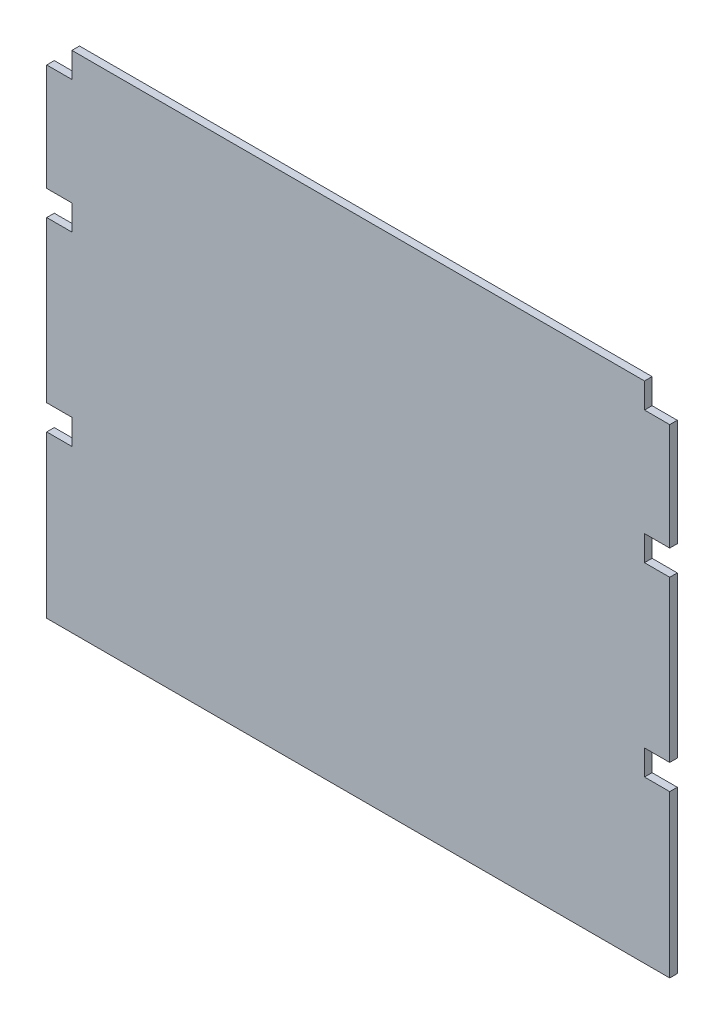
ISO-10303-21;
HEADER;
FILE_DESCRIPTION(('STEP AP214'),'2;1');
FILE_NAME('part.step','',(''),(''),'','','');
FILE_SCHEMA(('AUTOMOTIVE_DESIGN { 1 0 10303 214 1 1 1 1 }'));
ENDSEC;
DATA;
#1=APPLICATION_CONTEXT('core data for automotive mechanical design processes');
#2=APPLICATION_PROTOCOL_DEFINITION('international standard','automotive_design',2000,#1);
#3=PRODUCT_CONTEXT('',#1,'mechanical');
#4=PRODUCT('Part','Part','',(#3));
#5=PRODUCT_RELATED_PRODUCT_CATEGORY('part','',(#4));
#6=PRODUCT_DEFINITION_FORMATION('','',#4);
#7=PRODUCT_DEFINITION_CONTEXT('part definition',#1,'design');
#8=PRODUCT_DEFINITION('design','',#6,#7);
#9=PRODUCT_DEFINITION_SHAPE('','',#8);
#10=(LENGTH_UNIT() NAMED_UNIT(*) SI_UNIT(.MILLI.,.METRE.));
#11=(NAMED_UNIT(*) PLANE_ANGLE_UNIT() SI_UNIT($,.RADIAN.));
#12=(NAMED_UNIT(*) SI_UNIT($,.STERADIAN.) SOLID_ANGLE_UNIT());
#13=UNCERTAINTY_MEASURE_WITH_UNIT(LENGTH_MEASURE(1.E-05),#10,'distance_accuracy_value','');
#14=(GEOMETRIC_REPRESENTATION_CONTEXT(3) GLOBAL_UNCERTAINTY_ASSIGNED_CONTEXT((#13)) GLOBAL_UNIT_ASSIGNED_CONTEXT((#10,
#11,#12)) REPRESENTATION_CONTEXT('',''));
#15=CARTESIAN_POINT('',(0.,0.,0.));
#16=DIRECTION('',(0.,0.,1.));
#17=DIRECTION('',(1.,0.,0.));
#18=AXIS2_PLACEMENT_3D('',#15,#16,#17);
#19=CARTESIAN_POINT('',(0.,0.,3.));
#20=DIRECTION('',(1.,0.,0.));
#21=DIRECTION('',(0.,0.,-1.));
#22=AXIS2_PLACEMENT_3D('',#19,#20,#21);
#23=PLANE('',#22);
#24=DIRECTION('',(0.,-1.,0.));
#25=VECTOR('',#24,1.);
#26=CARTESIAN_POINT('',(0.,0.,0.));
#27=LINE('',#26,#25);
#28=CARTESIAN_POINT('',(0.,137.6,0.));
#29=VERTEX_POINT('',#28);
#30=CARTESIAN_POINT('',(0.,74.,0.));
#31=VERTEX_POINT('',#30);
#32=EDGE_CURVE('E257',#29,#31,#27,.T.);
#33=ORIENTED_EDGE('',*,*,#32,.T.);
#34=DIRECTION('',(0.,0.,1.));
#35=VECTOR('',#34,1.);
#36=CARTESIAN_POINT('',(0.,74.,0.));
#37=LINE('',#36,#35);
#38=CARTESIAN_POINT('',(0.,74.,3.));
#39=VERTEX_POINT('',#38);
#40=EDGE_CURVE('E295',#31,#39,#37,.T.);
#41=ORIENTED_EDGE('',*,*,#40,.T.);
#42=DIRECTION('',(0.,-1.,0.));
#43=VECTOR('',#42,1.);
#44=CARTESIAN_POINT('',(0.,0.,3.));
#45=LINE('',#44,#43);
#46=CARTESIAN_POINT('',(0.,137.6,3.));
#47=VERTEX_POINT('',#46);
#48=EDGE_CURVE('E238',#47,#39,#45,.T.);
#49=ORIENTED_EDGE('',*,*,#48,.F.);
#50=DIRECTION('',(0.,0.,1.));
#51=VECTOR('',#50,1.);
#52=CARTESIAN_POINT('',(0.,137.6,0.));
#53=LINE('',#52,#51);
#54=EDGE_CURVE('E309',#29,#47,#53,.T.);
#55=ORIENTED_EDGE('',*,*,#54,.F.);
#56=EDGE_LOOP('',(#33,#41,#49,#55));
#57=FACE_BOUND('',#56,.T.);
#58=ADVANCED_FACE('F33',(#57),#23,.F.);
#59=CARTESIAN_POINT('',(0.,190.,0.));
#60=VERTEX_POINT('',#59);
#61=CARTESIAN_POINT('',(0.,147.6,0.));
#62=VERTEX_POINT('',#61);
#63=EDGE_CURVE('E223',#60,#62,#27,.T.);
#64=ORIENTED_EDGE('',*,*,#63,.T.);
#65=DIRECTION('',(0.,0.,1.));
#66=VECTOR('',#65,1.);
#67=CARTESIAN_POINT('',(0.,147.6,0.));
#68=LINE('',#67,#66);
#69=CARTESIAN_POINT('',(0.,147.6,3.));
#70=VERTEX_POINT('',#69);
#71=EDGE_CURVE('E274',#62,#70,#68,.T.);
#72=ORIENTED_EDGE('',*,*,#71,.T.);
#73=CARTESIAN_POINT('',(0.,190.,3.));
#74=VERTEX_POINT('',#73);
#75=EDGE_CURVE('E240',#74,#70,#45,.T.);
#76=ORIENTED_EDGE('',*,*,#75,.F.);
#77=DIRECTION('',(0.,0.,1.));
#78=VECTOR('',#77,1.);
#79=CARTESIAN_POINT('',(0.,190.,0.));
#80=LINE('',#79,#78);
#81=EDGE_CURVE('E276',#60,#74,#80,.T.);
#82=ORIENTED_EDGE('',*,*,#81,.F.);
#83=EDGE_LOOP('',(#64,#72,#76,#82));
#84=FACE_BOUND('',#83,.T.);
#85=ADVANCED_FACE('F272',(#84),#23,.F.);
#86=CARTESIAN_POINT('',(247.,0.,3.));
#87=DIRECTION('',(-1.,0.,0.));
#88=DIRECTION('',(0.,0.,1.));
#89=AXIS2_PLACEMENT_3D('',#86,#87,#88);
#90=PLANE('',#89);
#91=DIRECTION('',(0.,1.,0.));
#92=VECTOR('',#91,1.);
#93=CARTESIAN_POINT('',(247.,0.,0.));
#94=LINE('',#93,#92);
#95=CARTESIAN_POINT('',(247.,74.,0.));
#96=VERTEX_POINT('',#95);
#97=CARTESIAN_POINT('',(247.,137.6,0.));
#98=VERTEX_POINT('',#97);
#99=EDGE_CURVE('E218',#96,#98,#94,.T.);
#100=ORIENTED_EDGE('',*,*,#99,.T.);
#101=DIRECTION('',(0.,0.,1.));
#102=VECTOR('',#101,1.);
#103=CARTESIAN_POINT('',(247.,137.6,0.));
#104=LINE('',#103,#102);
#105=CARTESIAN_POINT('',(247.,137.6,3.));
#106=VERTEX_POINT('',#105);
#107=EDGE_CURVE('E332',#98,#106,#104,.T.);
#108=ORIENTED_EDGE('',*,*,#107,.T.);
#109=DIRECTION('',(0.,1.,0.));
#110=VECTOR('',#109,1.);
#111=CARTESIAN_POINT('',(247.,0.,3.));
#112=LINE('',#111,#110);
#113=CARTESIAN_POINT('',(247.,74.,3.));
#114=VERTEX_POINT('',#113);
#115=EDGE_CURVE('E252',#114,#106,#112,.T.);
#116=ORIENTED_EDGE('',*,*,#115,.F.);
#117=DIRECTION('',(0.,0.,1.));
#118=VECTOR('',#117,1.);
#119=CARTESIAN_POINT('',(247.,74.,0.));
#120=LINE('',#119,#118);
#121=EDGE_CURVE('E407',#96,#114,#120,.T.);
#122=ORIENTED_EDGE('',*,*,#121,.F.);
#123=EDGE_LOOP('',(#100,#108,#116,#122));
#124=FACE_BOUND('',#123,.T.);
#125=ADVANCED_FACE('F428',(#124),#90,.F.);
#126=CARTESIAN_POINT('',(247.,0.,0.));
#127=VERTEX_POINT('',#126);
#128=CARTESIAN_POINT('',(247.,64.,0.));
#129=VERTEX_POINT('',#128);
#130=EDGE_CURVE('E221',#127,#129,#94,.T.);
#131=ORIENTED_EDGE('',*,*,#130,.T.);
#132=DIRECTION('',(0.,0.,1.));
#133=VECTOR('',#132,1.);
#134=CARTESIAN_POINT('',(247.,64.,0.));
#135=LINE('',#134,#133);
#136=CARTESIAN_POINT('',(247.,64.,3.));
#137=VERTEX_POINT('',#136);
#138=EDGE_CURVE('E386',#129,#137,#135,.T.);
#139=ORIENTED_EDGE('',*,*,#138,.T.);
#140=CARTESIAN_POINT('',(247.,0.,3.));
#141=VERTEX_POINT('',#140);
#142=EDGE_CURVE('E245',#141,#137,#112,.T.);
#143=ORIENTED_EDGE('',*,*,#142,.F.);
#144=DIRECTION('',(0.,0.,-1.));
#145=VECTOR('',#144,1.);
#146=CARTESIAN_POINT('',(247.,0.,3.));
#147=LINE('',#146,#145);
#148=EDGE_CURVE('E41',#141,#127,#147,.T.);
#149=ORIENTED_EDGE('',*,*,#148,.T.);
#150=EDGE_LOOP('',(#131,#139,#143,#149));
#151=FACE_BOUND('',#150,.T.);
#152=ADVANCED_FACE('F385',(#151),#90,.F.);
#153=CARTESIAN_POINT('',(0.,64.,3.));
#154=VERTEX_POINT('',#153);
#155=CARTESIAN_POINT('',(0.,0.,3.));
#156=VERTEX_POINT('',#155);
#157=EDGE_CURVE('E233',#154,#156,#45,.T.);
#158=ORIENTED_EDGE('',*,*,#157,.F.);
#159=DIRECTION('',(0.,0.,1.));
#160=VECTOR('',#159,1.);
#161=CARTESIAN_POINT('',(0.,64.,0.));
#162=LINE('',#161,#160);
#163=CARTESIAN_POINT('',(0.,64.,0.));
#164=VERTEX_POINT('',#163);
#165=EDGE_CURVE('E355',#164,#154,#162,.T.);
#166=ORIENTED_EDGE('',*,*,#165,.F.);
#167=CARTESIAN_POINT('',(0.,0.,0.));
#168=VERTEX_POINT('',#167);
#169=EDGE_CURVE('E256',#164,#168,#27,.T.);
#170=ORIENTED_EDGE('',*,*,#169,.T.);
#171=DIRECTION('',(0.,0.,-1.));
#172=VECTOR('',#171,1.);
#173=CARTESIAN_POINT('',(0.,0.,3.));
#174=LINE('',#173,#172);
#175=EDGE_CURVE('E11',#156,#168,#174,.T.);
#176=ORIENTED_EDGE('',*,*,#175,.F.);
#177=EDGE_LOOP('',(#158,#166,#170,#176));
#178=FACE_BOUND('',#177,.T.);
#179=ADVANCED_FACE('F35',(#178),#23,.F.);
#180=CARTESIAN_POINT('',(0.,0.,3.));
#181=DIRECTION('',(0.,1.,0.));
#182=DIRECTION('',(0.,0.,1.));
#183=AXIS2_PLACEMENT_3D('',#180,#181,#182);
#184=PLANE('',#183);
#185=DIRECTION('',(1.,0.,0.));
#186=VECTOR('',#185,1.);
#187=CARTESIAN_POINT('',(0.,0.,0.));
#188=LINE('',#187,#186);
#189=EDGE_CURVE('E219',#168,#127,#188,.T.);
#190=ORIENTED_EDGE('',*,*,#189,.T.);
#191=ORIENTED_EDGE('',*,*,#148,.F.);
#192=DIRECTION('',(1.,0.,0.));
#193=VECTOR('',#192,1.);
#194=CARTESIAN_POINT('',(0.,0.,3.));
#195=LINE('',#194,#193);
#196=EDGE_CURVE('E336',#156,#141,#195,.T.);
#197=ORIENTED_EDGE('',*,*,#196,.F.);
#198=ORIENTED_EDGE('',*,*,#175,.T.);
#199=EDGE_LOOP('',(#190,#191,#197,#198));
#200=FACE_BOUND('',#199,.T.);
#201=ADVANCED_FACE('F384',(#200),#184,.F.);
#202=CARTESIAN_POINT('',(247.,147.6,3.));
#203=VERTEX_POINT('',#202);
#204=CARTESIAN_POINT('',(247.,190.,3.));
#205=VERTEX_POINT('',#204);
#206=EDGE_CURVE('E210',#203,#205,#112,.T.);
#207=ORIENTED_EDGE('',*,*,#206,.F.);
#208=DIRECTION('',(0.,0.,1.));
#209=VECTOR('',#208,1.);
#210=CARTESIAN_POINT('',(247.,147.6,0.));
#211=LINE('',#210,#209);
#212=CARTESIAN_POINT('',(247.,147.6,0.));
#213=VERTEX_POINT('',#212);
#214=EDGE_CURVE('E197',#213,#203,#211,.T.);
#215=ORIENTED_EDGE('',*,*,#214,.F.);
#216=CARTESIAN_POINT('',(247.,190.,0.));
#217=VERTEX_POINT('',#216);
#218=EDGE_CURVE('E208',#213,#217,#94,.T.);
#219=ORIENTED_EDGE('',*,*,#218,.T.);
#220=DIRECTION('',(0.,0.,1.));
#221=VECTOR('',#220,1.);
#222=CARTESIAN_POINT('',(247.,190.,0.));
#223=LINE('',#222,#221);
#224=EDGE_CURVE('E258',#217,#205,#223,.T.);
#225=ORIENTED_EDGE('',*,*,#224,.T.);
#226=EDGE_LOOP('',(#207,#215,#219,#225));
#227=FACE_BOUND('',#226,.T.);
#228=ADVANCED_FACE('F206',(#227),#90,.F.);
#229=CARTESIAN_POINT('',(0.,200.,3.));
#230=DIRECTION('',(0.,-1.,0.));
#231=DIRECTION('',(0.,0.,-1.));
#232=AXIS2_PLACEMENT_3D('',#229,#230,#231);
#233=PLANE('',#232);
#234=DIRECTION('',(-1.,0.,0.));
#235=VECTOR('',#234,1.);
#236=CARTESIAN_POINT('',(0.,200.,0.));
#237=LINE('',#236,#235);
#238=CARTESIAN_POINT('',(237.,200.,0.));
#239=VERTEX_POINT('',#238);
#240=CARTESIAN_POINT('',(10.,200.,0.));
#241=VERTEX_POINT('',#240);
#242=EDGE_CURVE('E227',#239,#241,#237,.T.);
#243=ORIENTED_EDGE('',*,*,#242,.T.);
#244=DIRECTION('',(0.,0.,1.));
#245=VECTOR('',#244,1.);
#246=CARTESIAN_POINT('',(10.,200.,0.));
#247=LINE('',#246,#245);
#248=CARTESIAN_POINT('',(10.,200.,3.));
#249=VERTEX_POINT('',#248);
#250=EDGE_CURVE('E301',#241,#249,#247,.T.);
#251=ORIENTED_EDGE('',*,*,#250,.T.);
#252=DIRECTION('',(-1.,0.,0.));
#253=VECTOR('',#252,1.);
#254=CARTESIAN_POINT('',(0.,200.,3.));
#255=LINE('',#254,#253);
#256=CARTESIAN_POINT('',(237.,200.,3.));
#257=VERTEX_POINT('',#256);
#258=EDGE_CURVE('E241',#257,#249,#255,.T.);
#259=ORIENTED_EDGE('',*,*,#258,.F.);
#260=DIRECTION('',(0.,0.,1.));
#261=VECTOR('',#260,1.);
#262=CARTESIAN_POINT('',(237.,200.,0.));
#263=LINE('',#262,#261);
#264=EDGE_CURVE('E328',#239,#257,#263,.T.);
#265=ORIENTED_EDGE('',*,*,#264,.F.);
#266=EDGE_LOOP('',(#243,#251,#259,#265));
#267=FACE_BOUND('',#266,.T.);
#268=ADVANCED_FACE('F441',(#267),#233,.F.);
#269=CARTESIAN_POINT('',(0.,0.,3.));
#270=DIRECTION('',(0.,0.,-1.));
#271=DIRECTION('',(-1.,0.,0.));
#272=AXIS2_PLACEMENT_3D('',#269,#270,#271);
#273=PLANE('',#272);
#274=ORIENTED_EDGE('',*,*,#115,.T.);
#275=DIRECTION('',(1.,0.,0.));
#276=VECTOR('',#275,1.);
#277=CARTESIAN_POINT('',(247.,137.6,3.));
#278=LINE('',#277,#276);
#279=CARTESIAN_POINT('',(237.,137.6,3.));
#280=VERTEX_POINT('',#279);
#281=EDGE_CURVE('E202',#280,#106,#278,.T.);
#282=ORIENTED_EDGE('',*,*,#281,.F.);
#283=DIRECTION('',(0.,-1.,0.));
#284=VECTOR('',#283,1.);
#285=CARTESIAN_POINT('',(237.,147.6,3.));
#286=LINE('',#285,#284);
#287=CARTESIAN_POINT('',(237.,147.6,3.));
#288=VERTEX_POINT('',#287);
#289=EDGE_CURVE('E559',#288,#280,#286,.T.);
#290=ORIENTED_EDGE('',*,*,#289,.F.);
#291=DIRECTION('',(-1.,0.,0.));
#292=VECTOR('',#291,1.);
#293=CARTESIAN_POINT('',(247.,147.6,3.));
#294=LINE('',#293,#292);
#295=EDGE_CURVE('E402',#203,#288,#294,.T.);
#296=ORIENTED_EDGE('',*,*,#295,.F.);
#297=ORIENTED_EDGE('',*,*,#206,.T.);
#298=DIRECTION('',(1.,0.,0.));
#299=VECTOR('',#298,1.);
#300=CARTESIAN_POINT('',(247.,190.,3.));
#301=LINE('',#300,#299);
#302=CARTESIAN_POINT('',(237.,190.,3.));
#303=VERTEX_POINT('',#302);
#304=EDGE_CURVE('E326',#303,#205,#301,.T.);
#305=ORIENTED_EDGE('',*,*,#304,.F.);
#306=DIRECTION('',(0.,-1.,0.));
#307=VECTOR('',#306,1.);
#308=CARTESIAN_POINT('',(237.,200.,3.));
#309=LINE('',#308,#307);
#310=EDGE_CURVE('E329',#257,#303,#309,.T.);
#311=ORIENTED_EDGE('',*,*,#310,.F.);
#312=ORIENTED_EDGE('',*,*,#258,.T.);
#313=DIRECTION('',(0.,1.,0.));
#314=VECTOR('',#313,1.);
#315=CARTESIAN_POINT('',(10.,200.,3.));
#316=LINE('',#315,#314);
#317=CARTESIAN_POINT('',(10.,190.,3.));
#318=VERTEX_POINT('',#317);
#319=EDGE_CURVE('E314',#318,#249,#316,.T.);
#320=ORIENTED_EDGE('',*,*,#319,.F.);
#321=DIRECTION('',(1.,0.,0.));
#322=VECTOR('',#321,1.);
#323=CARTESIAN_POINT('',(0.,190.,3.));
#324=LINE('',#323,#322);
#325=EDGE_CURVE('E316',#74,#318,#324,.T.);
#326=ORIENTED_EDGE('',*,*,#325,.F.);
#327=ORIENTED_EDGE('',*,*,#75,.T.);
#328=DIRECTION('',(-1.,0.,0.));
#329=VECTOR('',#328,1.);
#330=CARTESIAN_POINT('',(0.,147.6,3.));
#331=LINE('',#330,#329);
#332=CARTESIAN_POINT('',(10.,147.6,3.));
#333=VERTEX_POINT('',#332);
#334=EDGE_CURVE('E299',#333,#70,#331,.T.);
#335=ORIENTED_EDGE('',*,*,#334,.F.);
#336=DIRECTION('',(0.,1.,0.));
#337=VECTOR('',#336,1.);
#338=CARTESIAN_POINT('',(10.,147.6,3.));
#339=LINE('',#338,#337);
#340=CARTESIAN_POINT('',(10.,137.6,3.));
#341=VERTEX_POINT('',#340);
#342=EDGE_CURVE('E288',#341,#333,#339,.T.);
#343=ORIENTED_EDGE('',*,*,#342,.F.);
#344=DIRECTION('',(1.,0.,0.));
#345=VECTOR('',#344,1.);
#346=CARTESIAN_POINT('',(0.,137.6,3.));
#347=LINE('',#346,#345);
#348=EDGE_CURVE('E292',#47,#341,#347,.T.);
#349=ORIENTED_EDGE('',*,*,#348,.F.);
#350=ORIENTED_EDGE('',*,*,#48,.T.);
#351=DIRECTION('',(-1.,0.,0.));
#352=VECTOR('',#351,1.);
#353=CARTESIAN_POINT('',(0.,74.,3.));
#354=LINE('',#353,#352);
#355=CARTESIAN_POINT('',(10.,74.,3.));
#356=VERTEX_POINT('',#355);
#357=EDGE_CURVE('E306',#356,#39,#354,.T.);
#358=ORIENTED_EDGE('',*,*,#357,.F.);
#359=DIRECTION('',(0.,1.,0.));
#360=VECTOR('',#359,1.);
#361=CARTESIAN_POINT('',(10.,74.,3.));
#362=LINE('',#361,#360);
#363=CARTESIAN_POINT('',(10.,64.,3.));
#364=VERTEX_POINT('',#363);
#365=EDGE_CURVE('E370',#364,#356,#362,.T.);
#366=ORIENTED_EDGE('',*,*,#365,.F.);
#367=DIRECTION('',(1.,0.,0.));
#368=VECTOR('',#367,1.);
#369=CARTESIAN_POINT('',(0.,64.,3.));
#370=LINE('',#369,#368);
#371=EDGE_CURVE('E367',#154,#364,#370,.T.);
#372=ORIENTED_EDGE('',*,*,#371,.F.);
#373=ORIENTED_EDGE('',*,*,#157,.T.);
#374=ORIENTED_EDGE('',*,*,#196,.T.);
#375=ORIENTED_EDGE('',*,*,#142,.T.);
#376=DIRECTION('',(1.,0.,0.));
#377=VECTOR('',#376,1.);
#378=CARTESIAN_POINT('',(247.,64.,3.));
#379=LINE('',#378,#377);
#380=CARTESIAN_POINT('',(237.,64.,3.));
#381=VERTEX_POINT('',#380);
#382=EDGE_CURVE('E389',#381,#137,#379,.T.);
#383=ORIENTED_EDGE('',*,*,#382,.F.);
#384=DIRECTION('',(0.,-1.,0.));
#385=VECTOR('',#384,1.);
#386=CARTESIAN_POINT('',(237.,74.,3.));
#387=LINE('',#386,#385);
#388=CARTESIAN_POINT('',(237.,74.,3.));
#389=VERTEX_POINT('',#388);
#390=EDGE_CURVE('E392',#389,#381,#387,.T.);
#391=ORIENTED_EDGE('',*,*,#390,.F.);
#392=DIRECTION('',(-1.,0.,0.));
#393=VECTOR('',#392,1.);
#394=CARTESIAN_POINT('',(247.,74.,3.));
#395=LINE('',#394,#393);
#396=EDGE_CURVE('E375',#114,#389,#395,.T.);
#397=ORIENTED_EDGE('',*,*,#396,.F.);
#398=EDGE_LOOP('',(#274,#282,#290,#296,#297,#305,#311,#312,#320,#326,#327,#335,#343,#349,#350,
#358,#366,#372,#373,#374,#375,#383,#391,#397));
#399=FACE_BOUND('',#398,.T.);
#400=ADVANCED_FACE('F345',(#399),#273,.F.);
#401=CARTESIAN_POINT('',(0.,0.,0.));
#402=DIRECTION('',(0.,0.,-1.));
#403=DIRECTION('',(-1.,0.,0.));
#404=AXIS2_PLACEMENT_3D('',#401,#402,#403);
#405=PLANE('',#404);
#406=DIRECTION('',(1.,0.,0.));
#407=VECTOR('',#406,1.);
#408=CARTESIAN_POINT('',(247.,137.6,0.));
#409=LINE('',#408,#407);
#410=CARTESIAN_POINT('',(237.,137.6,0.));
#411=VERTEX_POINT('',#410);
#412=EDGE_CURVE('E211',#411,#98,#409,.T.);
#413=ORIENTED_EDGE('',*,*,#412,.T.);
#414=ORIENTED_EDGE('',*,*,#99,.F.);
#415=DIRECTION('',(-1.,0.,0.));
#416=VECTOR('',#415,1.);
#417=CARTESIAN_POINT('',(247.,74.,0.));
#418=LINE('',#417,#416);
#419=CARTESIAN_POINT('',(237.,74.,0.));
#420=VERTEX_POINT('',#419);
#421=EDGE_CURVE('E394',#96,#420,#418,.T.);
#422=ORIENTED_EDGE('',*,*,#421,.T.);
#423=DIRECTION('',(0.,-1.,0.));
#424=VECTOR('',#423,1.);
#425=CARTESIAN_POINT('',(237.,74.,0.));
#426=LINE('',#425,#424);
#427=CARTESIAN_POINT('',(237.,64.,0.));
#428=VERTEX_POINT('',#427);
#429=EDGE_CURVE('E56',#420,#428,#426,.T.);
#430=ORIENTED_EDGE('',*,*,#429,.T.);
#431=DIRECTION('',(1.,0.,0.));
#432=VECTOR('',#431,1.);
#433=CARTESIAN_POINT('',(247.,64.,0.));
#434=LINE('',#433,#432);
#435=EDGE_CURVE('E408',#428,#129,#434,.T.);
#436=ORIENTED_EDGE('',*,*,#435,.T.);
#437=ORIENTED_EDGE('',*,*,#130,.F.);
#438=ORIENTED_EDGE('',*,*,#189,.F.);
#439=ORIENTED_EDGE('',*,*,#169,.F.);
#440=DIRECTION('',(1.,0.,0.));
#441=VECTOR('',#440,1.);
#442=CARTESIAN_POINT('',(0.,64.,0.));
#443=LINE('',#442,#441);
#444=CARTESIAN_POINT('',(10.,64.,0.));
#445=VERTEX_POINT('',#444);
#446=EDGE_CURVE('E359',#164,#445,#443,.T.);
#447=ORIENTED_EDGE('',*,*,#446,.T.);
#448=DIRECTION('',(0.,1.,0.));
#449=VECTOR('',#448,1.);
#450=CARTESIAN_POINT('',(10.,74.,0.));
#451=LINE('',#450,#449);
#452=CARTESIAN_POINT('',(10.,74.,0.));
#453=VERTEX_POINT('',#452);
#454=EDGE_CURVE('E356',#445,#453,#451,.T.);
#455=ORIENTED_EDGE('',*,*,#454,.T.);
#456=DIRECTION('',(-1.,0.,0.));
#457=VECTOR('',#456,1.);
#458=CARTESIAN_POINT('',(0.,74.,0.));
#459=LINE('',#458,#457);
#460=EDGE_CURVE('E362',#453,#31,#459,.T.);
#461=ORIENTED_EDGE('',*,*,#460,.T.);
#462=ORIENTED_EDGE('',*,*,#32,.F.);
#463=DIRECTION('',(1.,0.,0.));
#464=VECTOR('',#463,1.);
#465=CARTESIAN_POINT('',(0.,137.6,0.));
#466=LINE('',#465,#464);
#467=CARTESIAN_POINT('',(10.,137.6,0.));
#468=VERTEX_POINT('',#467);
#469=EDGE_CURVE('E287',#29,#468,#466,.T.);
#470=ORIENTED_EDGE('',*,*,#469,.T.);
#471=DIRECTION('',(0.,1.,0.));
#472=VECTOR('',#471,1.);
#473=CARTESIAN_POINT('',(10.,147.6,0.));
#474=LINE('',#473,#472);
#475=CARTESIAN_POINT('',(10.,147.6,0.));
#476=VERTEX_POINT('',#475);
#477=EDGE_CURVE('E285',#468,#476,#474,.T.);
#478=ORIENTED_EDGE('',*,*,#477,.T.);
#479=DIRECTION('',(-1.,0.,0.));
#480=VECTOR('',#479,1.);
#481=CARTESIAN_POINT('',(0.,147.6,0.));
#482=LINE('',#481,#480);
#483=EDGE_CURVE('E283',#476,#62,#482,.T.);
#484=ORIENTED_EDGE('',*,*,#483,.T.);
#485=ORIENTED_EDGE('',*,*,#63,.F.);
#486=DIRECTION('',(1.,0.,0.));
#487=VECTOR('',#486,1.);
#488=CARTESIAN_POINT('',(0.,190.,0.));
#489=LINE('',#488,#487);
#490=CARTESIAN_POINT('',(10.,190.,0.));
#491=VERTEX_POINT('',#490);
#492=EDGE_CURVE('E280',#60,#491,#489,.T.);
#493=ORIENTED_EDGE('',*,*,#492,.T.);
#494=DIRECTION('',(0.,1.,0.));
#495=VECTOR('',#494,1.);
#496=CARTESIAN_POINT('',(10.,200.,0.));
#497=LINE('',#496,#495);
#498=EDGE_CURVE('E313',#491,#241,#497,.T.);
#499=ORIENTED_EDGE('',*,*,#498,.T.);
#500=ORIENTED_EDGE('',*,*,#242,.F.);
#501=DIRECTION('',(0.,-1.,0.));
#502=VECTOR('',#501,1.);
#503=CARTESIAN_POINT('',(237.,200.,0.));
#504=LINE('',#503,#502);
#505=CARTESIAN_POINT('',(237.,190.,0.));
#506=VERTEX_POINT('',#505);
#507=EDGE_CURVE('E324',#239,#506,#504,.T.);
#508=ORIENTED_EDGE('',*,*,#507,.T.);
#509=DIRECTION('',(1.,0.,0.));
#510=VECTOR('',#509,1.);
#511=CARTESIAN_POINT('',(247.,190.,0.));
#512=LINE('',#511,#510);
#513=EDGE_CURVE('E217',#506,#217,#512,.T.);
#514=ORIENTED_EDGE('',*,*,#513,.T.);
#515=ORIENTED_EDGE('',*,*,#218,.F.);
#516=DIRECTION('',(-1.,0.,0.));
#517=VECTOR('',#516,1.);
#518=CARTESIAN_POINT('',(247.,147.6,0.));
#519=LINE('',#518,#517);
#520=CARTESIAN_POINT('',(237.,147.6,0.));
#521=VERTEX_POINT('',#520);
#522=EDGE_CURVE('E193',#213,#521,#519,.T.);
#523=ORIENTED_EDGE('',*,*,#522,.T.);
#524=DIRECTION('',(0.,-1.,0.));
#525=VECTOR('',#524,1.);
#526=CARTESIAN_POINT('',(237.,147.6,0.));
#527=LINE('',#526,#525);
#528=EDGE_CURVE('E48',#521,#411,#527,.T.);
#529=ORIENTED_EDGE('',*,*,#528,.T.);
#530=EDGE_LOOP('',(#413,#414,#422,#430,#436,#437,#438,#439,#447,#455,#461,#462,#470,#478,#484,
#485,#493,#499,#500,#508,#514,#515,#523,#529));
#531=FACE_BOUND('',#530,.T.);
#532=ADVANCED_FACE('F215',(#531),#405,.T.);
#533=CARTESIAN_POINT('',(247.,190.,0.));
#534=DIRECTION('',(0.,-1.,0.));
#535=DIRECTION('',(0.,0.,-1.));
#536=AXIS2_PLACEMENT_3D('',#533,#534,#535);
#537=PLANE('',#536);
#538=ORIENTED_EDGE('',*,*,#304,.T.);
#539=ORIENTED_EDGE('',*,*,#224,.F.);
#540=ORIENTED_EDGE('',*,*,#513,.F.);
#541=DIRECTION('',(0.,0.,1.));
#542=VECTOR('',#541,1.);
#543=CARTESIAN_POINT('',(237.,190.,0.));
#544=LINE('',#543,#542);
#545=EDGE_CURVE('E265',#506,#303,#544,.T.);
#546=ORIENTED_EDGE('',*,*,#545,.T.);
#547=EDGE_LOOP('',(#538,#539,#540,#546));
#548=FACE_BOUND('',#547,.T.);
#549=ADVANCED_FACE('F451',(#548),#537,.F.);
#550=CARTESIAN_POINT('',(237.,200.,0.));
#551=DIRECTION('',(-1.,0.,0.));
#552=DIRECTION('',(0.,0.,1.));
#553=AXIS2_PLACEMENT_3D('',#550,#551,#552);
#554=PLANE('',#553);
#555=ORIENTED_EDGE('',*,*,#310,.T.);
#556=ORIENTED_EDGE('',*,*,#545,.F.);
#557=ORIENTED_EDGE('',*,*,#507,.F.);
#558=ORIENTED_EDGE('',*,*,#264,.T.);
#559=EDGE_LOOP('',(#555,#556,#557,#558));
#560=FACE_BOUND('',#559,.T.);
#561=ADVANCED_FACE('F453',(#560),#554,.F.);
#562=CARTESIAN_POINT('',(10.,200.,0.));
#563=DIRECTION('',(1.,0.,0.));
#564=DIRECTION('',(0.,0.,-1.));
#565=AXIS2_PLACEMENT_3D('',#562,#563,#564);
#566=PLANE('',#565);
#567=ORIENTED_EDGE('',*,*,#319,.T.);
#568=ORIENTED_EDGE('',*,*,#250,.F.);
#569=ORIENTED_EDGE('',*,*,#498,.F.);
#570=DIRECTION('',(0.,0.,1.));
#571=VECTOR('',#570,1.);
#572=CARTESIAN_POINT('',(10.,190.,0.));
#573=LINE('',#572,#571);
#574=EDGE_CURVE('E321',#491,#318,#573,.T.);
#575=ORIENTED_EDGE('',*,*,#574,.T.);
#576=EDGE_LOOP('',(#567,#568,#569,#575));
#577=FACE_BOUND('',#576,.T.);
#578=ADVANCED_FACE('F456',(#577),#566,.F.);
#579=CARTESIAN_POINT('',(0.,190.,0.));
#580=DIRECTION('',(0.,-1.,0.));
#581=DIRECTION('',(0.,0.,-1.));
#582=AXIS2_PLACEMENT_3D('',#579,#580,#581);
#583=PLANE('',#582);
#584=ORIENTED_EDGE('',*,*,#325,.T.);
#585=ORIENTED_EDGE('',*,*,#574,.F.);
#586=ORIENTED_EDGE('',*,*,#492,.F.);
#587=ORIENTED_EDGE('',*,*,#81,.T.);
#588=EDGE_LOOP('',(#584,#585,#586,#587));
#589=FACE_BOUND('',#588,.T.);
#590=ADVANCED_FACE('F461',(#589),#583,.F.);
#591=CARTESIAN_POINT('',(0.,147.6,0.));
#592=DIRECTION('',(0.,1.,0.));
#593=DIRECTION('',(0.,0.,1.));
#594=AXIS2_PLACEMENT_3D('',#591,#592,#593);
#595=PLANE('',#594);
#596=ORIENTED_EDGE('',*,*,#334,.T.);
#597=ORIENTED_EDGE('',*,*,#71,.F.);
#598=ORIENTED_EDGE('',*,*,#483,.F.);
#599=DIRECTION('',(0.,0.,1.));
#600=VECTOR('',#599,1.);
#601=CARTESIAN_POINT('',(10.,147.6,0.));
#602=LINE('',#601,#600);
#603=EDGE_CURVE('E304',#476,#333,#602,.T.);
#604=ORIENTED_EDGE('',*,*,#603,.T.);
#605=EDGE_LOOP('',(#596,#597,#598,#604));
#606=FACE_BOUND('',#605,.T.);
#607=ADVANCED_FACE('F464',(#606),#595,.F.);
#608=CARTESIAN_POINT('',(10.,147.6,0.));
#609=DIRECTION('',(1.,0.,0.));
#610=DIRECTION('',(0.,0.,-1.));
#611=AXIS2_PLACEMENT_3D('',#608,#609,#610);
#612=PLANE('',#611);
#613=ORIENTED_EDGE('',*,*,#342,.T.);
#614=ORIENTED_EDGE('',*,*,#603,.F.);
#615=ORIENTED_EDGE('',*,*,#477,.F.);
#616=DIRECTION('',(0.,0.,1.));
#617=VECTOR('',#616,1.);
#618=CARTESIAN_POINT('',(10.,137.6,0.));
#619=LINE('',#618,#617);
#620=EDGE_CURVE('E307',#468,#341,#619,.T.);
#621=ORIENTED_EDGE('',*,*,#620,.T.);
#622=EDGE_LOOP('',(#613,#614,#615,#621));
#623=FACE_BOUND('',#622,.T.);
#624=ADVANCED_FACE('F418',(#623),#612,.F.);
#625=CARTESIAN_POINT('',(0.,137.6,0.));
#626=DIRECTION('',(0.,-1.,0.));
#627=DIRECTION('',(1.,0.,0.));
#628=AXIS2_PLACEMENT_3D('',#625,#626,#627);
#629=PLANE('',#628);
#630=ORIENTED_EDGE('',*,*,#348,.T.);
#631=ORIENTED_EDGE('',*,*,#620,.F.);
#632=ORIENTED_EDGE('',*,*,#469,.F.);
#633=ORIENTED_EDGE('',*,*,#54,.T.);
#634=EDGE_LOOP('',(#630,#631,#632,#633));
#635=FACE_BOUND('',#634,.T.);
#636=ADVANCED_FACE('F411',(#635),#629,.F.);
#637=CARTESIAN_POINT('',(0.,74.,0.));
#638=DIRECTION('',(0.,1.,0.));
#639=DIRECTION('',(0.,0.,1.));
#640=AXIS2_PLACEMENT_3D('',#637,#638,#639);
#641=PLANE('',#640);
#642=ORIENTED_EDGE('',*,*,#357,.T.);
#643=ORIENTED_EDGE('',*,*,#40,.F.);
#644=ORIENTED_EDGE('',*,*,#460,.F.);
#645=DIRECTION('',(0.,0.,1.));
#646=VECTOR('',#645,1.);
#647=CARTESIAN_POINT('',(10.,74.,0.));
#648=LINE('',#647,#646);
#649=EDGE_CURVE('E373',#453,#356,#648,.T.);
#650=ORIENTED_EDGE('',*,*,#649,.T.);
#651=EDGE_LOOP('',(#642,#643,#644,#650));
#652=FACE_BOUND('',#651,.T.);
#653=ADVANCED_FACE('F409',(#652),#641,.F.);
#654=CARTESIAN_POINT('',(10.,74.,0.));
#655=DIRECTION('',(1.,0.,0.));
#656=DIRECTION('',(0.,0.,-1.));
#657=AXIS2_PLACEMENT_3D('',#654,#655,#656);
#658=PLANE('',#657);
#659=ORIENTED_EDGE('',*,*,#365,.T.);
#660=ORIENTED_EDGE('',*,*,#649,.F.);
#661=ORIENTED_EDGE('',*,*,#454,.F.);
#662=DIRECTION('',(0.,0.,1.));
#663=VECTOR('',#662,1.);
#664=CARTESIAN_POINT('',(10.,64.,0.));
#665=LINE('',#664,#663);
#666=EDGE_CURVE('E357',#445,#364,#665,.T.);
#667=ORIENTED_EDGE('',*,*,#666,.T.);
#668=EDGE_LOOP('',(#659,#660,#661,#667));
#669=FACE_BOUND('',#668,.T.);
#670=ADVANCED_FACE('F378',(#669),#658,.F.);
#671=CARTESIAN_POINT('',(0.,64.,0.));
#672=DIRECTION('',(0.,-1.,0.));
#673=DIRECTION('',(1.,0.,0.));
#674=AXIS2_PLACEMENT_3D('',#671,#672,#673);
#675=PLANE('',#674);
#676=ORIENTED_EDGE('',*,*,#371,.T.);
#677=ORIENTED_EDGE('',*,*,#666,.F.);
#678=ORIENTED_EDGE('',*,*,#446,.F.);
#679=ORIENTED_EDGE('',*,*,#165,.T.);
#680=EDGE_LOOP('',(#676,#677,#678,#679));
#681=FACE_BOUND('',#680,.T.);
#682=ADVANCED_FACE('F381',(#681),#675,.F.);
#683=CARTESIAN_POINT('',(247.,64.,0.));
#684=DIRECTION('',(0.,-1.,0.));
#685=DIRECTION('',(1.,0.,0.));
#686=AXIS2_PLACEMENT_3D('',#683,#684,#685);
#687=PLANE('',#686);
#688=ORIENTED_EDGE('',*,*,#382,.T.);
#689=ORIENTED_EDGE('',*,*,#138,.F.);
#690=ORIENTED_EDGE('',*,*,#435,.F.);
#691=DIRECTION('',(0.,0.,1.));
#692=VECTOR('',#691,1.);
#693=CARTESIAN_POINT('',(237.,64.,0.));
#694=LINE('',#693,#692);
#695=EDGE_CURVE('E403',#428,#381,#694,.T.);
#696=ORIENTED_EDGE('',*,*,#695,.T.);
#697=EDGE_LOOP('',(#688,#689,#690,#696));
#698=FACE_BOUND('',#697,.T.);
#699=ADVANCED_FACE('F500',(#698),#687,.F.);
#700=CARTESIAN_POINT('',(237.,74.,0.));
#701=DIRECTION('',(-1.,0.,0.));
#702=DIRECTION('',(0.,0.,1.));
#703=AXIS2_PLACEMENT_3D('',#700,#701,#702);
#704=PLANE('',#703);
#705=ORIENTED_EDGE('',*,*,#390,.T.);
#706=ORIENTED_EDGE('',*,*,#695,.F.);
#707=ORIENTED_EDGE('',*,*,#429,.F.);
#708=DIRECTION('',(0.,0.,1.));
#709=VECTOR('',#708,1.);
#710=CARTESIAN_POINT('',(237.,74.,0.));
#711=LINE('',#710,#709);
#712=EDGE_CURVE('E405',#420,#389,#711,.T.);
#713=ORIENTED_EDGE('',*,*,#712,.T.);
#714=EDGE_LOOP('',(#705,#706,#707,#713));
#715=FACE_BOUND('',#714,.T.);
#716=ADVANCED_FACE('F508',(#715),#704,.F.);
#717=CARTESIAN_POINT('',(247.,74.,0.));
#718=DIRECTION('',(0.,1.,0.));
#719=DIRECTION('',(0.,0.,1.));
#720=AXIS2_PLACEMENT_3D('',#717,#718,#719);
#721=PLANE('',#720);
#722=ORIENTED_EDGE('',*,*,#396,.T.);
#723=ORIENTED_EDGE('',*,*,#712,.F.);
#724=ORIENTED_EDGE('',*,*,#421,.F.);
#725=ORIENTED_EDGE('',*,*,#121,.T.);
#726=EDGE_LOOP('',(#722,#723,#724,#725));
#727=FACE_BOUND('',#726,.T.);
#728=ADVANCED_FACE('F517',(#727),#721,.F.);
#729=CARTESIAN_POINT('',(247.,137.6,0.));
#730=DIRECTION('',(0.,-1.,0.));
#731=DIRECTION('',(1.,0.,0.));
#732=AXIS2_PLACEMENT_3D('',#729,#730,#731);
#733=PLANE('',#732);
#734=ORIENTED_EDGE('',*,*,#281,.T.);
#735=ORIENTED_EDGE('',*,*,#107,.F.);
#736=ORIENTED_EDGE('',*,*,#412,.F.);
#737=DIRECTION('',(0.,0.,1.));
#738=VECTOR('',#737,1.);
#739=CARTESIAN_POINT('',(237.,137.6,0.));
#740=LINE('',#739,#738);
#741=EDGE_CURVE('E561',#411,#280,#740,.T.);
#742=ORIENTED_EDGE('',*,*,#741,.T.);
#743=EDGE_LOOP('',(#734,#735,#736,#742));
#744=FACE_BOUND('',#743,.T.);
#745=ADVANCED_FACE('F526',(#744),#733,.F.);
#746=CARTESIAN_POINT('',(237.,147.6,0.));
#747=DIRECTION('',(-1.,0.,0.));
#748=DIRECTION('',(0.,0.,1.));
#749=AXIS2_PLACEMENT_3D('',#746,#747,#748);
#750=PLANE('',#749);
#751=ORIENTED_EDGE('',*,*,#289,.T.);
#752=ORIENTED_EDGE('',*,*,#741,.F.);
#753=ORIENTED_EDGE('',*,*,#528,.F.);
#754=DIRECTION('',(0.,0.,1.));
#755=VECTOR('',#754,1.);
#756=CARTESIAN_POINT('',(237.,147.6,0.));
#757=LINE('',#756,#755);
#758=EDGE_CURVE('E199',#521,#288,#757,.T.);
#759=ORIENTED_EDGE('',*,*,#758,.T.);
#760=EDGE_LOOP('',(#751,#752,#753,#759));
#761=FACE_BOUND('',#760,.T.);
#762=ADVANCED_FACE('F536',(#761),#750,.F.);
#763=CARTESIAN_POINT('',(247.,147.6,0.));
#764=DIRECTION('',(0.,1.,0.));
#765=DIRECTION('',(0.,0.,1.));
#766=AXIS2_PLACEMENT_3D('',#763,#764,#765);
#767=PLANE('',#766);
#768=ORIENTED_EDGE('',*,*,#295,.T.);
#769=ORIENTED_EDGE('',*,*,#758,.F.);
#770=ORIENTED_EDGE('',*,*,#522,.F.);
#771=ORIENTED_EDGE('',*,*,#214,.T.);
#772=EDGE_LOOP('',(#768,#769,#770,#771));
#773=FACE_BOUND('',#772,.T.);
#774=ADVANCED_FACE('F196',(#773),#767,.F.);
#775=CLOSED_SHELL('',(#58,#85,#125,#152,#179,#201,#228,#268,#400,#532,#549,#561,#578,#590,#607,
#624,#636,#653,#670,#682,#699,#716,#728,#745,#762,#774));
#776=MANIFOLD_SOLID_BREP('B2',#775);
#777=ADVANCED_BREP_SHAPE_REPRESENTATION('',(#18,#776),#14);
#778=SHAPE_DEFINITION_REPRESENTATION(#9,#777);
ENDSEC;
END-ISO-10303-21;
